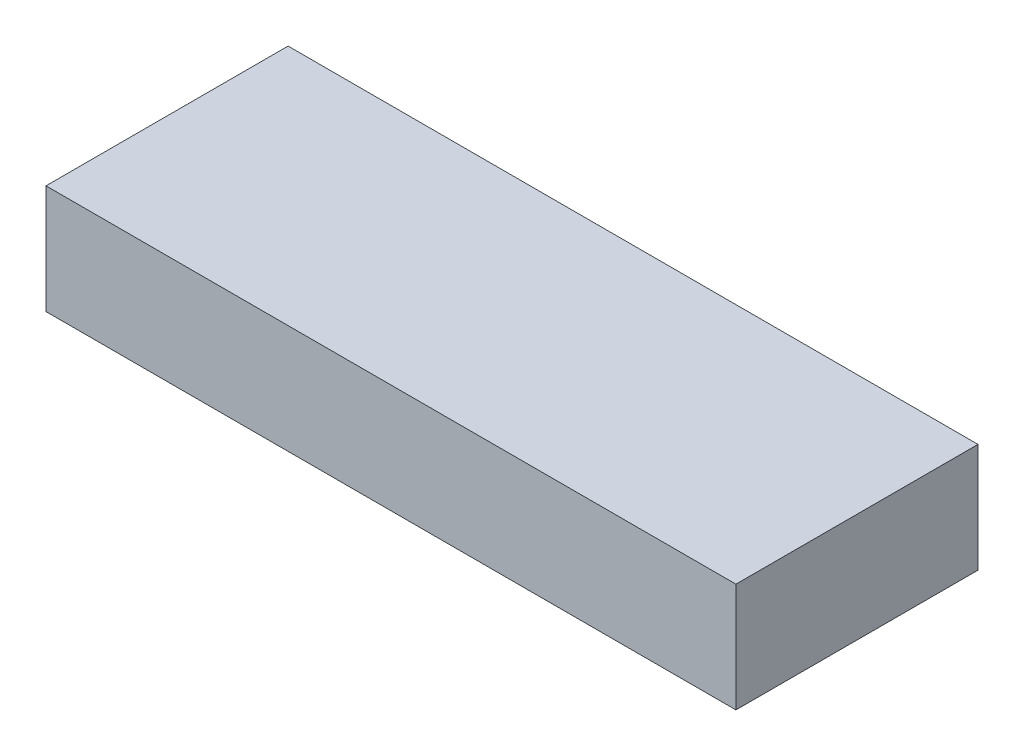
ISO-10303-21;
HEADER;
FILE_DESCRIPTION(('STEP AP214'),'2;1');
FILE_NAME('part.step','',(''),(''),'','','');
FILE_SCHEMA(('AUTOMOTIVE_DESIGN { 1 0 10303 214 1 1 1 1 }'));
ENDSEC;
DATA;
#1=APPLICATION_CONTEXT('core data for automotive mechanical design processes');
#2=APPLICATION_PROTOCOL_DEFINITION('international standard','automotive_design',2000,#1);
#3=PRODUCT_CONTEXT('',#1,'mechanical');
#4=PRODUCT('Part','Part','',(#3));
#5=PRODUCT_RELATED_PRODUCT_CATEGORY('part','',(#4));
#6=PRODUCT_DEFINITION_FORMATION('','',#4);
#7=PRODUCT_DEFINITION_CONTEXT('part definition',#1,'design');
#8=PRODUCT_DEFINITION('design','',#6,#7);
#9=PRODUCT_DEFINITION_SHAPE('','',#8);
#10=(LENGTH_UNIT() NAMED_UNIT(*) SI_UNIT(.MILLI.,.METRE.));
#11=(NAMED_UNIT(*) PLANE_ANGLE_UNIT() SI_UNIT($,.RADIAN.));
#12=(NAMED_UNIT(*) SI_UNIT($,.STERADIAN.) SOLID_ANGLE_UNIT());
#13=UNCERTAINTY_MEASURE_WITH_UNIT(LENGTH_MEASURE(1.E-05),#10,'distance_accuracy_value','');
#14=(GEOMETRIC_REPRESENTATION_CONTEXT(3) GLOBAL_UNCERTAINTY_ASSIGNED_CONTEXT((#13)) GLOBAL_UNIT_ASSIGNED_CONTEXT((#10,
#11,#12)) REPRESENTATION_CONTEXT('',''));
#15=CARTESIAN_POINT('',(0.,0.,0.));
#16=DIRECTION('',(0.,0.,1.));
#17=DIRECTION('',(1.,0.,0.));
#18=AXIS2_PLACEMENT_3D('',#15,#16,#17);
#19=CARTESIAN_POINT('',(72.39,22.86,-25.4));
#20=DIRECTION('',(-1.,0.,0.));
#21=DIRECTION('',(0.,0.,1.));
#22=AXIS2_PLACEMENT_3D('',#19,#20,#21);
#23=PLANE('',#22);
#24=DIRECTION('',(0.,0.,-1.));
#25=VECTOR('',#24,1.);
#26=CARTESIAN_POINT('',(72.39,0.,-25.4));
#27=LINE('',#26,#25);
#28=CARTESIAN_POINT('',(72.39,0.,25.4));
#29=VERTEX_POINT('',#28);
#30=CARTESIAN_POINT('',(72.39,0.,-25.4));
#31=VERTEX_POINT('',#30);
#32=EDGE_CURVE('E98',#29,#31,#27,.T.);
#33=ORIENTED_EDGE('',*,*,#32,.T.);
#34=DIRECTION('',(0.,-1.,0.));
#35=VECTOR('',#34,1.);
#36=CARTESIAN_POINT('',(72.39,22.86,-25.4));
#37=LINE('',#36,#35);
#38=CARTESIAN_POINT('',(72.39,22.86,-25.4));
#39=VERTEX_POINT('',#38);
#40=EDGE_CURVE('E11',#39,#31,#37,.T.);
#41=ORIENTED_EDGE('',*,*,#40,.F.);
#42=DIRECTION('',(0.,0.,-1.));
#43=VECTOR('',#42,1.);
#44=CARTESIAN_POINT('',(72.39,22.86,-25.4));
#45=LINE('',#44,#43);
#46=CARTESIAN_POINT('',(72.39,22.86,25.4));
#47=VERTEX_POINT('',#46);
#48=EDGE_CURVE('E86',#47,#39,#45,.T.);
#49=ORIENTED_EDGE('',*,*,#48,.F.);
#50=DIRECTION('',(0.,-1.,0.));
#51=VECTOR('',#50,1.);
#52=CARTESIAN_POINT('',(72.39,22.86,25.4));
#53=LINE('',#52,#51);
#54=EDGE_CURVE('E94',#47,#29,#53,.T.);
#55=ORIENTED_EDGE('',*,*,#54,.T.);
#56=EDGE_LOOP('',(#33,#41,#49,#55));
#57=FACE_BOUND('',#56,.T.);
#58=ADVANCED_FACE('F35',(#57),#23,.F.);
#59=CARTESIAN_POINT('',(-72.39,22.86,-25.4));
#60=DIRECTION('',(0.,0.,1.));
#61=DIRECTION('',(1.,0.,0.));
#62=AXIS2_PLACEMENT_3D('',#59,#60,#61);
#63=PLANE('',#62);
#64=DIRECTION('',(-1.,0.,0.));
#65=VECTOR('',#64,1.);
#66=CARTESIAN_POINT('',(-72.39,0.,-25.4));
#67=LINE('',#66,#65);
#68=CARTESIAN_POINT('',(-72.39,0.,-25.4));
#69=VERTEX_POINT('',#68);
#70=EDGE_CURVE('E90',#31,#69,#67,.T.);
#71=ORIENTED_EDGE('',*,*,#70,.T.);
#72=DIRECTION('',(0.,-1.,0.));
#73=VECTOR('',#72,1.);
#74=CARTESIAN_POINT('',(-72.39,22.86,-25.4));
#75=LINE('',#74,#73);
#76=CARTESIAN_POINT('',(-72.39,22.86,-25.4));
#77=VERTEX_POINT('',#76);
#78=EDGE_CURVE('E43',#77,#69,#75,.T.);
#79=ORIENTED_EDGE('',*,*,#78,.F.);
#80=DIRECTION('',(-1.,0.,0.));
#81=VECTOR('',#80,1.);
#82=CARTESIAN_POINT('',(-72.39,22.86,-25.4));
#83=LINE('',#82,#81);
#84=EDGE_CURVE('E81',#39,#77,#83,.T.);
#85=ORIENTED_EDGE('',*,*,#84,.F.);
#86=ORIENTED_EDGE('',*,*,#40,.T.);
#87=EDGE_LOOP('',(#71,#79,#85,#86));
#88=FACE_BOUND('',#87,.T.);
#89=ADVANCED_FACE('F89',(#88),#63,.F.);
#90=CARTESIAN_POINT('',(-72.39,22.86,-25.4));
#91=DIRECTION('',(1.,0.,0.));
#92=DIRECTION('',(0.,0.,-1.));
#93=AXIS2_PLACEMENT_3D('',#90,#91,#92);
#94=PLANE('',#93);
#95=DIRECTION('',(0.,0.,1.));
#96=VECTOR('',#95,1.);
#97=CARTESIAN_POINT('',(-72.39,0.,-25.4));
#98=LINE('',#97,#96);
#99=CARTESIAN_POINT('',(-72.39,0.,25.4));
#100=VERTEX_POINT('',#99);
#101=EDGE_CURVE('E68',#69,#100,#98,.T.);
#102=ORIENTED_EDGE('',*,*,#101,.T.);
#103=DIRECTION('',(0.,-1.,0.));
#104=VECTOR('',#103,1.);
#105=CARTESIAN_POINT('',(-72.39,22.86,25.4));
#106=LINE('',#105,#104);
#107=CARTESIAN_POINT('',(-72.39,22.86,25.4));
#108=VERTEX_POINT('',#107);
#109=EDGE_CURVE('E91',#108,#100,#106,.T.);
#110=ORIENTED_EDGE('',*,*,#109,.F.);
#111=DIRECTION('',(0.,0.,1.));
#112=VECTOR('',#111,1.);
#113=CARTESIAN_POINT('',(-72.39,22.86,-25.4));
#114=LINE('',#113,#112);
#115=EDGE_CURVE('E84',#77,#108,#114,.T.);
#116=ORIENTED_EDGE('',*,*,#115,.F.);
#117=ORIENTED_EDGE('',*,*,#78,.T.);
#118=EDGE_LOOP('',(#102,#110,#116,#117));
#119=FACE_BOUND('',#118,.T.);
#120=ADVANCED_FACE('F92',(#119),#94,.F.);
#121=CARTESIAN_POINT('',(-72.39,22.86,25.4));
#122=DIRECTION('',(0.,0.,-1.));
#123=DIRECTION('',(-1.,0.,0.));
#124=AXIS2_PLACEMENT_3D('',#121,#122,#123);
#125=PLANE('',#124);
#126=DIRECTION('',(1.,0.,0.));
#127=VECTOR('',#126,1.);
#128=CARTESIAN_POINT('',(-72.39,0.,25.4));
#129=LINE('',#128,#127);
#130=EDGE_CURVE('E74',#100,#29,#129,.T.);
#131=ORIENTED_EDGE('',*,*,#130,.T.);
#132=ORIENTED_EDGE('',*,*,#54,.F.);
#133=DIRECTION('',(1.,0.,0.));
#134=VECTOR('',#133,1.);
#135=CARTESIAN_POINT('',(-72.39,22.86,25.4));
#136=LINE('',#135,#134);
#137=EDGE_CURVE('E51',#108,#47,#136,.T.);
#138=ORIENTED_EDGE('',*,*,#137,.F.);
#139=ORIENTED_EDGE('',*,*,#109,.T.);
#140=EDGE_LOOP('',(#131,#132,#138,#139));
#141=FACE_BOUND('',#140,.T.);
#142=ADVANCED_FACE('F105',(#141),#125,.F.);
#143=CARTESIAN_POINT('',(0.,22.86,0.));
#144=DIRECTION('',(0.,1.,0.));
#145=DIRECTION('',(0.,0.,1.));
#146=AXIS2_PLACEMENT_3D('',#143,#144,#145);
#147=PLANE('',#146);
#148=ORIENTED_EDGE('',*,*,#48,.T.);
#149=ORIENTED_EDGE('',*,*,#84,.T.);
#150=ORIENTED_EDGE('',*,*,#115,.T.);
#151=ORIENTED_EDGE('',*,*,#137,.T.);
#152=EDGE_LOOP('',(#148,#149,#150,#151));
#153=FACE_BOUND('',#152,.T.);
#154=ADVANCED_FACE('F82',(#153),#147,.T.);
#155=CARTESIAN_POINT('',(0.,0.,0.));
#156=DIRECTION('',(0.,1.,0.));
#157=DIRECTION('',(0.,0.,1.));
#158=AXIS2_PLACEMENT_3D('',#155,#156,#157);
#159=PLANE('',#158);
#160=ORIENTED_EDGE('',*,*,#32,.F.);
#161=ORIENTED_EDGE('',*,*,#130,.F.);
#162=ORIENTED_EDGE('',*,*,#101,.F.);
#163=ORIENTED_EDGE('',*,*,#70,.F.);
#164=EDGE_LOOP('',(#160,#161,#162,#163));
#165=FACE_BOUND('',#164,.T.);
#166=ADVANCED_FACE('F108',(#165),#159,.F.);
#167=CLOSED_SHELL('',(#58,#89,#120,#142,#154,#166));
#168=MANIFOLD_SOLID_BREP('B2',#167);
#169=ADVANCED_BREP_SHAPE_REPRESENTATION('',(#18,#168),#14);
#170=SHAPE_DEFINITION_REPRESENTATION(#9,#169);
ENDSEC;
END-ISO-10303-21;
